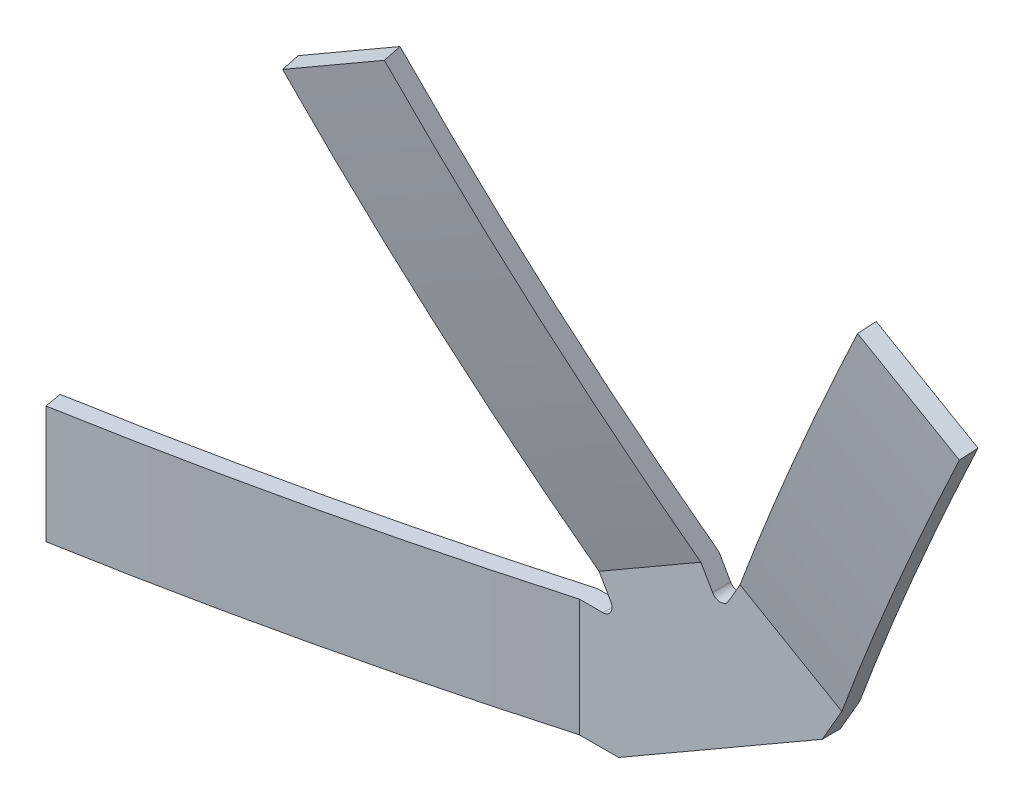
ISO-10303-21;
HEADER;
FILE_DESCRIPTION(('STEP AP214'),'2;1');
FILE_NAME('part.step','',(''),(''),'','','');
FILE_SCHEMA(('AUTOMOTIVE_DESIGN { 1 0 10303 214 1 1 1 1 }'));
ENDSEC;
DATA;
#1=APPLICATION_CONTEXT('core data for automotive mechanical design processes');
#2=APPLICATION_PROTOCOL_DEFINITION('international standard','automotive_design',2000,#1);
#3=PRODUCT_CONTEXT('',#1,'mechanical');
#4=PRODUCT('Part','Part','',(#3));
#5=PRODUCT_RELATED_PRODUCT_CATEGORY('part','',(#4));
#6=PRODUCT_DEFINITION_FORMATION('','',#4);
#7=PRODUCT_DEFINITION_CONTEXT('part definition',#1,'design');
#8=PRODUCT_DEFINITION('design','',#6,#7);
#9=PRODUCT_DEFINITION_SHAPE('','',#8);
#10=(LENGTH_UNIT() NAMED_UNIT(*) SI_UNIT(.MILLI.,.METRE.));
#11=(NAMED_UNIT(*) PLANE_ANGLE_UNIT() SI_UNIT($,.RADIAN.));
#12=(NAMED_UNIT(*) SI_UNIT($,.STERADIAN.) SOLID_ANGLE_UNIT());
#13=UNCERTAINTY_MEASURE_WITH_UNIT(LENGTH_MEASURE(1.E-05),#10,'distance_accuracy_value','');
#14=(GEOMETRIC_REPRESENTATION_CONTEXT(3) GLOBAL_UNCERTAINTY_ASSIGNED_CONTEXT((#13)) GLOBAL_UNIT_ASSIGNED_CONTEXT((#10,
#11,#12)) REPRESENTATION_CONTEXT('',''));
#15=CARTESIAN_POINT('',(0.,0.,0.));
#16=DIRECTION('',(0.,0.,1.));
#17=DIRECTION('',(1.,0.,0.));
#18=AXIS2_PLACEMENT_3D('',#15,#16,#17);
#19=CARTESIAN_POINT('',(26.8467875173177,6.50000000000006,2.));
#20=DIRECTION('',(-0.866025403784435,0.500000000000007,0.));
#21=DIRECTION('',(-0.500000000000007,-0.866025403784435,0.));
#22=AXIS2_PLACEMENT_3D('',#19,#20,#21);
#23=PLANE('',#22);
#24=DIRECTION('',(0.500000000000007,0.866025403784435,0.));
#25=VECTOR('',#24,1.);
#26=CARTESIAN_POINT('',(26.8467875173177,6.50000000000006,0.));
#27=LINE('',#26,#25);
#28=CARTESIAN_POINT('',(26.8467875173177,6.50000000000006,0.));
#29=VERTEX_POINT('',#28);
#30=CARTESIAN_POINT('',(29.0118510267785,10.2499999999999,0.));
#31=VERTEX_POINT('',#30);
#32=EDGE_CURVE('E164',#29,#31,#27,.T.);
#33=ORIENTED_EDGE('',*,*,#32,.T.);
#34=CARTESIAN_POINT('',(95.154945516374,124.813200225808,-465.057436623551));
#35=DIRECTION('',(0.866025403784437,-0.500000000000003,0.));
#36=DIRECTION('',(-0.500000000000003,-0.866025403784437,0.));
#37=AXIS2_PLACEMENT_3D('',#34,#35,#36);
#38=CIRCLE('',#37,483.506003223854);
#39=CARTESIAN_POINT('',(53.1812171455081,52.112570104373,11.1052243024201));
#40=VERTEX_POINT('',#39);
#41=EDGE_CURVE('E297',#40,#31,#38,.T.);
#42=ORIENTED_EDGE('',*,*,#41,.F.);
#43=DIRECTION('',(0.0868111835034082,0.150361380493086,-0.984812303779228));
#44=VECTOR('',#43,1.);
#45=CARTESIAN_POINT('',(53.0141927083141,51.8232752930475,13.));
#46=LINE('',#45,#44);
#47=CARTESIAN_POINT('',(53.0141927083141,51.8232752930475,13.));
#48=VERTEX_POINT('',#47);
#49=EDGE_CURVE('E292',#48,#40,#46,.T.);
#50=ORIENTED_EDGE('',*,*,#49,.F.);
#51=CARTESIAN_POINT('',(95.154945516374,124.813200225808,-465.057436623551));
#52=DIRECTION('',(-0.866025403784437,0.500000000000003,0.));
#53=DIRECTION('',(-0.500000000000003,-0.866025403784437,0.));
#54=AXIS2_PLACEMENT_3D('',#51,#52,#53);
#55=CIRCLE('',#54,485.43);
#56=CARTESIAN_POINT('',(29.0118510267787,10.2499999999999,2.));
#57=VERTEX_POINT('',#56);
#58=EDGE_CURVE('E288',#57,#48,#55,.T.);
#59=ORIENTED_EDGE('',*,*,#58,.F.);
#60=DIRECTION('',(0.500000000000007,0.866025403784435,0.));
#61=VECTOR('',#60,1.);
#62=CARTESIAN_POINT('',(26.8467875173177,6.50000000000006,2.));
#63=LINE('',#62,#61);
#64=CARTESIAN_POINT('',(26.8467875173177,6.50000000000006,2.));
#65=VERTEX_POINT('',#64);
#66=EDGE_CURVE('E92',#65,#57,#63,.T.);
#67=ORIENTED_EDGE('',*,*,#66,.F.);
#68=DIRECTION('',(0.,0.,-1.));
#69=VECTOR('',#68,1.);
#70=CARTESIAN_POINT('',(26.8467875173177,6.50000000000006,2.));
#71=LINE('',#70,#69);
#72=EDGE_CURVE('E183',#65,#29,#71,.T.);
#73=ORIENTED_EDGE('',*,*,#72,.T.);
#74=EDGE_LOOP('',(#33,#42,#50,#59,#67,#73));
#75=FACE_BOUND('',#74,.T.);
#76=ADVANCED_FACE('F34',(#75),#23,.F.);
#77=CARTESIAN_POINT('',(17.7535207775811,16.7500000000001,2.));
#78=DIRECTION('',(0.866025403784434,-0.500000000000008,0.));
#79=DIRECTION('',(0.500000000000008,0.866025403784434,0.));
#80=AXIS2_PLACEMENT_3D('',#77,#78,#79);
#81=PLANE('',#80);
#82=DIRECTION('',(-0.500000000000008,-0.866025403784434,0.));
#83=VECTOR('',#82,1.);
#84=CARTESIAN_POINT('',(17.7535207775811,16.7500000000001,0.));
#85=LINE('',#84,#83);
#86=CARTESIAN_POINT('',(17.7535207775811,16.7500000000001,0.));
#87=VERTEX_POINT('',#86);
#88=CARTESIAN_POINT('',(16.4544826719044,14.5,0.));
#89=VERTEX_POINT('',#88);
#90=EDGE_CURVE('E189',#87,#89,#85,.T.);
#91=ORIENTED_EDGE('',*,*,#90,.T.);
#92=DIRECTION('',(0.,0.,-1.));
#93=VECTOR('',#92,1.);
#94=CARTESIAN_POINT('',(16.4544826719044,14.5,2.));
#95=LINE('',#94,#93);
#96=CARTESIAN_POINT('',(16.4544826719044,14.5,2.));
#97=VERTEX_POINT('',#96);
#98=EDGE_CURVE('E11',#97,#89,#95,.T.);
#99=ORIENTED_EDGE('',*,*,#98,.F.);
#100=DIRECTION('',(-0.500000000000008,-0.866025403784434,0.));
#101=VECTOR('',#100,1.);
#102=CARTESIAN_POINT('',(17.7535207775811,16.7500000000001,2.));
#103=LINE('',#102,#101);
#104=CARTESIAN_POINT('',(17.7535207775811,16.7500000000001,2.));
#105=VERTEX_POINT('',#104);
#106=EDGE_CURVE('E169',#105,#97,#103,.T.);
#107=ORIENTED_EDGE('',*,*,#106,.F.);
#108=CARTESIAN_POINT('',(83.8966152671763,131.313200225808,-465.057436623551));
#109=DIRECTION('',(-0.866025403784437,0.500000000000003,0.));
#110=DIRECTION('',(-0.500000000000003,-0.866025403784437,0.));
#111=AXIS2_PLACEMENT_3D('',#108,#109,#110);
#112=CIRCLE('',#111,485.43);
#113=CARTESIAN_POINT('',(41.7558624591164,58.3232752930475,13.));
#114=VERTEX_POINT('',#113);
#115=EDGE_CURVE('E306',#105,#114,#112,.T.);
#116=ORIENTED_EDGE('',*,*,#115,.T.);
#117=DIRECTION('',(0.0868111835034082,0.150361380493086,-0.984812303779228));
#118=VECTOR('',#117,1.);
#119=CARTESIAN_POINT('',(41.7558624591164,58.3232752930475,13.));
#120=LINE('',#119,#118);
#121=CARTESIAN_POINT('',(41.9228868963104,58.612570104373,11.1052243024201));
#122=VERTEX_POINT('',#121);
#123=EDGE_CURVE('E300',#114,#122,#120,.T.);
#124=ORIENTED_EDGE('',*,*,#123,.T.);
#125=CARTESIAN_POINT('',(83.8966152671763,131.313200225808,-465.057436623551));
#126=DIRECTION('',(0.866025403784437,-0.500000000000003,0.));
#127=DIRECTION('',(-0.500000000000003,-0.866025403784437,0.));
#128=AXIS2_PLACEMENT_3D('',#125,#126,#127);
#129=CIRCLE('',#128,483.506003223854);
#130=EDGE_CURVE('E295',#122,#87,#129,.T.);
#131=ORIENTED_EDGE('',*,*,#130,.T.);
#132=EDGE_LOOP('',(#91,#99,#107,#116,#124,#131));
#133=FACE_BOUND('',#132,.T.);
#134=ADVANCED_FACE('F348',(#133),#81,.F.);
#135=CARTESIAN_POINT('',(15.5884572681199,15.,2.));
#136=DIRECTION('',(0.,0.,-1.));
#137=DIRECTION('',(-1.,0.,0.));
#138=AXIS2_PLACEMENT_3D('',#135,#136,#137);
#139=CYLINDRICAL_SURFACE('',#138,0.999999999999999);
#140=CARTESIAN_POINT('',(15.5884572681199,15.,0.));
#141=DIRECTION('',(0.,0.,-1.));
#142=DIRECTION('',(1.,0.,0.));
#143=AXIS2_PLACEMENT_3D('',#140,#141,#142);
#144=CIRCLE('',#143,0.999999999999999);
#145=CARTESIAN_POINT('',(14.7224318643355,14.5,0.));
#146=VERTEX_POINT('',#145);
#147=EDGE_CURVE('E191',#89,#146,#144,.T.);
#148=ORIENTED_EDGE('',*,*,#147,.T.);
#149=DIRECTION('',(0.,0.,-1.));
#150=VECTOR('',#149,1.);
#151=CARTESIAN_POINT('',(14.7224318643355,14.5,2.));
#152=LINE('',#151,#150);
#153=CARTESIAN_POINT('',(14.7224318643355,14.5,2.));
#154=VERTEX_POINT('',#153);
#155=EDGE_CURVE('E42',#154,#146,#152,.T.);
#156=ORIENTED_EDGE('',*,*,#155,.F.);
#157=CARTESIAN_POINT('',(15.5884572681199,15.,2.));
#158=DIRECTION('',(0.,0.,-1.));
#159=DIRECTION('',(1.,0.,0.));
#160=AXIS2_PLACEMENT_3D('',#157,#158,#159);
#161=CIRCLE('',#160,0.999999999999999);
#162=EDGE_CURVE('E171',#97,#154,#161,.T.);
#163=ORIENTED_EDGE('',*,*,#162,.F.);
#164=ORIENTED_EDGE('',*,*,#98,.T.);
#165=EDGE_LOOP('',(#148,#156,#163,#164));
#166=FACE_BOUND('',#165,.T.);
#167=ADVANCED_FACE('F350',(#166),#139,.F.);
#168=CARTESIAN_POINT('',(14.7224318643355,14.5,2.));
#169=DIRECTION('',(-0.86602540378444,-0.499999999999997,0.));
#170=DIRECTION('',(0.499999999999997,-0.86602540378444,0.));
#171=AXIS2_PLACEMENT_3D('',#168,#169,#170);
#172=PLANE('',#171);
#173=DIRECTION('',(-0.499999999999997,0.86602540378444,0.));
#174=VECTOR('',#173,1.);
#175=CARTESIAN_POINT('',(14.7224318643355,14.5,0.));
#176=LINE('',#175,#174);
#177=CARTESIAN_POINT('',(13.4233937586586,16.75,0.));
#178=VERTEX_POINT('',#177);
#179=EDGE_CURVE('E193',#146,#178,#176,.T.);
#180=ORIENTED_EDGE('',*,*,#179,.T.);
#181=CARTESIAN_POINT('',(-52.7197007309364,131.313200225808,-465.057436623551));
#182=DIRECTION('',(0.866025403784439,0.499999999999999,0.));
#183=DIRECTION('',(0.499999999999999,-0.866025403784439,0.));
#184=AXIS2_PLACEMENT_3D('',#181,#182,#183);
#185=CIRCLE('',#184,483.506003223854);
#186=CARTESIAN_POINT('',(-10.7459723600708,58.6125701043732,11.1052243024201));
#187=VERTEX_POINT('',#186);
#188=EDGE_CURVE('E241',#187,#178,#185,.T.);
#189=ORIENTED_EDGE('',*,*,#188,.F.);
#190=DIRECTION('',(-0.0868111835034071,0.150361380493087,-0.984812303779228));
#191=VECTOR('',#190,1.);
#192=CARTESIAN_POINT('',(-10.5789479228768,58.3232752930476,13.));
#193=LINE('',#192,#191);
#194=CARTESIAN_POINT('',(-10.5789479228768,58.3232752930476,13.));
#195=VERTEX_POINT('',#194);
#196=EDGE_CURVE('E245',#195,#187,#193,.T.);
#197=ORIENTED_EDGE('',*,*,#196,.F.);
#198=CARTESIAN_POINT('',(-52.7197007309364,131.313200225808,-465.057436623551));
#199=DIRECTION('',(-0.866025403784439,-0.499999999999999,0.));
#200=DIRECTION('',(0.499999999999999,-0.866025403784439,0.));
#201=AXIS2_PLACEMENT_3D('',#198,#199,#200);
#202=CIRCLE('',#201,485.43);
#203=CARTESIAN_POINT('',(13.4233937586588,16.75,2.));
#204=VERTEX_POINT('',#203);
#205=EDGE_CURVE('E249',#204,#195,#202,.T.);
#206=ORIENTED_EDGE('',*,*,#205,.F.);
#207=DIRECTION('',(-0.499999999999997,0.86602540378444,0.));
#208=VECTOR('',#207,1.);
#209=CARTESIAN_POINT('',(14.7224318643355,14.5,2.));
#210=LINE('',#209,#208);
#211=EDGE_CURVE('E173',#154,#204,#210,.T.);
#212=ORIENTED_EDGE('',*,*,#211,.F.);
#213=ORIENTED_EDGE('',*,*,#155,.T.);
#214=EDGE_LOOP('',(#180,#189,#197,#206,#212,#213));
#215=FACE_BOUND('',#214,.T.);
#216=ADVANCED_FACE('F224',(#215),#172,.F.);
#217=CARTESIAN_POINT('',(2.16506350946103,10.2500000000002,2.));
#218=DIRECTION('',(0.866025403784441,0.499999999999996,0.));
#219=DIRECTION('',(-0.499999999999996,0.866025403784441,0.));
#220=AXIS2_PLACEMENT_3D('',#217,#218,#219);
#221=PLANE('',#220);
#222=DIRECTION('',(0.499999999999996,-0.866025403784441,0.));
#223=VECTOR('',#222,1.);
#224=CARTESIAN_POINT('',(2.16506350946103,10.2500000000002,0.));
#225=LINE('',#224,#223);
#226=CARTESIAN_POINT('',(2.16506350946103,10.2500000000002,0.));
#227=VERTEX_POINT('',#226);
#228=CARTESIAN_POINT('',(3.46410161513777,8.00000000000001,0.));
#229=VERTEX_POINT('',#228);
#230=EDGE_CURVE('E199',#227,#229,#225,.T.);
#231=ORIENTED_EDGE('',*,*,#230,.T.);
#232=DIRECTION('',(0.,0.,-1.));
#233=VECTOR('',#232,1.);
#234=CARTESIAN_POINT('',(3.46410161513777,8.00000000000001,2.));
#235=LINE('',#234,#233);
#236=CARTESIAN_POINT('',(3.46410161513777,8.00000000000001,2.));
#237=VERTEX_POINT('',#236);
#238=EDGE_CURVE('E217',#237,#229,#235,.T.);
#239=ORIENTED_EDGE('',*,*,#238,.F.);
#240=DIRECTION('',(0.499999999999996,-0.866025403784441,0.));
#241=VECTOR('',#240,1.);
#242=CARTESIAN_POINT('',(2.16506350946103,10.2500000000002,2.));
#243=LINE('',#242,#241);
#244=CARTESIAN_POINT('',(2.16506350946103,10.2500000000002,2.));
#245=VERTEX_POINT('',#244);
#246=EDGE_CURVE('E177',#245,#237,#243,.T.);
#247=ORIENTED_EDGE('',*,*,#246,.F.);
#248=CARTESIAN_POINT('',(-63.9780309801341,124.813200225808,-465.057436623551));
#249=DIRECTION('',(-0.866025403784439,-0.499999999999999,0.));
#250=DIRECTION('',(0.499999999999999,-0.866025403784439,0.));
#251=AXIS2_PLACEMENT_3D('',#248,#249,#250);
#252=CIRCLE('',#251,485.43);
#253=CARTESIAN_POINT('',(-21.8372781720745,51.8232752930476,13.));
#254=VERTEX_POINT('',#253);
#255=EDGE_CURVE('E253',#245,#254,#252,.T.);
#256=ORIENTED_EDGE('',*,*,#255,.T.);
#257=DIRECTION('',(-0.0868111835034071,0.150361380493087,-0.984812303779228));
#258=VECTOR('',#257,1.);
#259=CARTESIAN_POINT('',(-21.8372781720745,51.8232752930476,13.));
#260=LINE('',#259,#258);
#261=CARTESIAN_POINT('',(-22.0043026092685,52.1125701043732,11.1052243024201));
#262=VERTEX_POINT('',#261);
#263=EDGE_CURVE('E256',#254,#262,#260,.T.);
#264=ORIENTED_EDGE('',*,*,#263,.T.);
#265=CARTESIAN_POINT('',(-63.9780309801341,124.813200225808,-465.057436623551));
#266=DIRECTION('',(0.866025403784439,0.499999999999999,0.));
#267=DIRECTION('',(0.499999999999999,-0.866025403784439,0.));
#268=AXIS2_PLACEMENT_3D('',#265,#266,#267);
#269=CIRCLE('',#268,483.506003223854);
#270=EDGE_CURVE('E260',#262,#227,#269,.T.);
#271=ORIENTED_EDGE('',*,*,#270,.T.);
#272=EDGE_LOOP('',(#231,#239,#247,#256,#264,#271));
#273=FACE_BOUND('',#272,.T.);
#274=ADVANCED_FACE('F357',(#273),#221,.F.);
#275=CARTESIAN_POINT('',(2.5980762113533,7.5,2.));
#276=DIRECTION('',(0.,0.,-1.));
#277=DIRECTION('',(-1.,0.,0.));
#278=AXIS2_PLACEMENT_3D('',#275,#276,#277);
#279=CYLINDRICAL_SURFACE('',#278,1.00000000000001);
#280=CARTESIAN_POINT('',(2.5980762113533,7.5,0.));
#281=DIRECTION('',(0.,0.,-1.));
#282=DIRECTION('',(1.,0.,0.));
#283=AXIS2_PLACEMENT_3D('',#280,#281,#282);
#284=CIRCLE('',#283,1.00000000000001);
#285=CARTESIAN_POINT('',(2.5980762113533,6.49999999999998,0.));
#286=VERTEX_POINT('',#285);
#287=EDGE_CURVE('E201',#229,#286,#284,.T.);
#288=ORIENTED_EDGE('',*,*,#287,.T.);
#289=DIRECTION('',(0.,0.,-1.));
#290=VECTOR('',#289,1.);
#291=CARTESIAN_POINT('',(2.5980762113533,6.49999999999998,2.));
#292=LINE('',#291,#290);
#293=CARTESIAN_POINT('',(2.5980762113533,6.49999999999998,2.));
#294=VERTEX_POINT('',#293);
#295=EDGE_CURVE('E214',#294,#286,#292,.T.);
#296=ORIENTED_EDGE('',*,*,#295,.F.);
#297=CARTESIAN_POINT('',(2.5980762113533,7.5,2.));
#298=DIRECTION('',(0.,0.,-1.));
#299=DIRECTION('',(1.,0.,0.));
#300=AXIS2_PLACEMENT_3D('',#297,#298,#299);
#301=CIRCLE('',#300,1.00000000000001);
#302=EDGE_CURVE('E179',#237,#294,#301,.T.);
#303=ORIENTED_EDGE('',*,*,#302,.F.);
#304=ORIENTED_EDGE('',*,*,#238,.T.);
#305=EDGE_LOOP('',(#288,#296,#303,#304));
#306=FACE_BOUND('',#305,.T.);
#307=ADVANCED_FACE('F384',(#306),#279,.F.);
#308=CARTESIAN_POINT('',(2.5980762113533,6.5,2.));
#309=DIRECTION('',(0.,-1.,0.));
#310=DIRECTION('',(0.,0.,-1.));
#311=AXIS2_PLACEMENT_3D('',#308,#309,#310);
#312=PLANE('',#311);
#313=DIRECTION('',(-1.,0.,0.));
#314=VECTOR('',#313,1.);
#315=CARTESIAN_POINT('',(2.5980762113533,6.5,0.));
#316=LINE('',#315,#314);
#317=CARTESIAN_POINT('',(-1.89960891026766E-13,6.5,0.));
#318=VERTEX_POINT('',#317);
#319=EDGE_CURVE('E203',#286,#318,#316,.T.);
#320=ORIENTED_EDGE('',*,*,#319,.T.);
#321=CARTESIAN_POINT('',(-132.286188979191,6.49999999999976,-465.057436623551));
#322=DIRECTION('',(0.,1.,0.));
#323=DIRECTION('',(1.,0.,0.));
#324=AXIS2_PLACEMENT_3D('',#321,#322,#323);
#325=CIRCLE('',#324,483.506003223854);
#326=CARTESIAN_POINT('',(-48.3387322374591,6.49999999999991,11.1052243024201));
#327=VERTEX_POINT('',#326);
#328=EDGE_CURVE('E155',#327,#318,#325,.T.);
#329=ORIENTED_EDGE('',*,*,#328,.F.);
#330=DIRECTION('',(-0.173622367006815,0.,-0.984812303779228));
#331=VECTOR('',#330,1.);
#332=CARTESIAN_POINT('',(-48.0046833630711,6.49999999999991,13.));
#333=LINE('',#332,#331);
#334=CARTESIAN_POINT('',(-48.0046833630711,6.49999999999991,13.));
#335=VERTEX_POINT('',#334);
#336=EDGE_CURVE('E262',#335,#327,#333,.T.);
#337=ORIENTED_EDGE('',*,*,#336,.F.);
#338=CARTESIAN_POINT('',(-132.286188979191,6.49999999999976,-465.057436623551));
#339=DIRECTION('',(0.,-1.,0.));
#340=DIRECTION('',(1.,0.,0.));
#341=AXIS2_PLACEMENT_3D('',#338,#339,#340);
#342=CIRCLE('',#341,485.43);
#343=CARTESIAN_POINT('',(0.,6.5,2.));
#344=VERTEX_POINT('',#343);
#345=EDGE_CURVE('E160',#344,#335,#342,.T.);
#346=ORIENTED_EDGE('',*,*,#345,.F.);
#347=DIRECTION('',(-1.,0.,0.));
#348=VECTOR('',#347,1.);
#349=CARTESIAN_POINT('',(2.5980762113533,6.5,2.));
#350=LINE('',#349,#348);
#351=EDGE_CURVE('E127',#294,#344,#350,.T.);
#352=ORIENTED_EDGE('',*,*,#351,.F.);
#353=ORIENTED_EDGE('',*,*,#295,.T.);
#354=EDGE_LOOP('',(#320,#329,#337,#346,#352,#353));
#355=FACE_BOUND('',#354,.T.);
#356=ADVANCED_FACE('F276',(#355),#312,.F.);
#357=CARTESIAN_POINT('',(-1.66533453693773E-13,-6.5,2.));
#358=DIRECTION('',(0.,1.,0.));
#359=DIRECTION('',(-1.,0.,0.));
#360=AXIS2_PLACEMENT_3D('',#357,#358,#359);
#361=PLANE('',#360);
#362=DIRECTION('',(1.,0.,0.));
#363=VECTOR('',#362,1.);
#364=CARTESIAN_POINT('',(-1.66533453693773E-13,-6.5,0.));
#365=LINE('',#364,#363);
#366=CARTESIAN_POINT('',(-1.66533453693773E-13,-6.5,0.));
#367=VERTEX_POINT('',#366);
#368=CARTESIAN_POINT('',(4.33012701892221,-6.49999999999999,0.));
#369=VERTEX_POINT('',#368);
#370=EDGE_CURVE('E209',#367,#369,#365,.T.);
#371=ORIENTED_EDGE('',*,*,#370,.T.);
#372=DIRECTION('',(0.,0.,-1.));
#373=VECTOR('',#372,1.);
#374=CARTESIAN_POINT('',(4.33012701892221,-6.49999999999999,2.));
#375=LINE('',#374,#373);
#376=CARTESIAN_POINT('',(4.33012701892221,-6.49999999999999,2.));
#377=VERTEX_POINT('',#376);
#378=EDGE_CURVE('E139',#377,#369,#375,.T.);
#379=ORIENTED_EDGE('',*,*,#378,.F.);
#380=DIRECTION('',(1.,0.,0.));
#381=VECTOR('',#380,1.);
#382=CARTESIAN_POINT('',(-1.66533453693773E-13,-6.5,2.));
#383=LINE('',#382,#381);
#384=CARTESIAN_POINT('',(-1.66533453693773E-13,-6.5,2.));
#385=VERTEX_POINT('',#384);
#386=EDGE_CURVE('E124',#385,#377,#383,.T.);
#387=ORIENTED_EDGE('',*,*,#386,.F.);
#388=CARTESIAN_POINT('',(-132.28618897919,-6.50000000000024,-465.057436623551));
#389=DIRECTION('',(0.,-1.,0.));
#390=DIRECTION('',(1.,0.,0.));
#391=AXIS2_PLACEMENT_3D('',#388,#389,#390);
#392=CIRCLE('',#391,485.43);
#393=CARTESIAN_POINT('',(-48.0046833630711,-6.50000000000009,13.));
#394=VERTEX_POINT('',#393);
#395=EDGE_CURVE('E138',#385,#394,#392,.T.);
#396=ORIENTED_EDGE('',*,*,#395,.T.);
#397=DIRECTION('',(-0.173622367006815,0.,-0.984812303779228));
#398=VECTOR('',#397,1.);
#399=CARTESIAN_POINT('',(-48.0046833630711,-6.50000000000009,13.));
#400=LINE('',#399,#398);
#401=CARTESIAN_POINT('',(-48.338732237459,-6.50000000000009,11.1052243024201));
#402=VERTEX_POINT('',#401);
#403=EDGE_CURVE('E146',#394,#402,#400,.T.);
#404=ORIENTED_EDGE('',*,*,#403,.T.);
#405=CARTESIAN_POINT('',(-132.28618897919,-6.50000000000024,-465.057436623551));
#406=DIRECTION('',(0.,1.,0.));
#407=DIRECTION('',(1.,0.,0.));
#408=AXIS2_PLACEMENT_3D('',#405,#406,#407);
#409=CIRCLE('',#408,483.506003223854);
#410=EDGE_CURVE('E149',#402,#367,#409,.T.);
#411=ORIENTED_EDGE('',*,*,#410,.T.);
#412=EDGE_LOOP('',(#371,#379,#387,#396,#404,#411));
#413=FACE_BOUND('',#412,.T.);
#414=ADVANCED_FACE('F135',(#413),#361,.F.);
#415=CARTESIAN_POINT('',(24.2487113059643,5.00000000000001,2.));
#416=DIRECTION('',(-0.500000000000001,0.866025403784438,0.));
#417=DIRECTION('',(-0.866025403784438,-0.500000000000001,0.));
#418=AXIS2_PLACEMENT_3D('',#415,#416,#417);
#419=PLANE('',#418);
#420=DIRECTION('',(0.866025403784438,0.500000000000001,0.));
#421=VECTOR('',#420,1.);
#422=CARTESIAN_POINT('',(24.2487113059643,5.00000000000001,0.));
#423=LINE('',#422,#421);
#424=EDGE_CURVE('E82',#369,#29,#423,.T.);
#425=ORIENTED_EDGE('',*,*,#424,.T.);
#426=ORIENTED_EDGE('',*,*,#72,.F.);
#427=DIRECTION('',(0.866025403784438,0.5,0.));
#428=VECTOR('',#427,1.);
#429=CARTESIAN_POINT('',(4.33012701892221,-6.49999999999999,2.));
#430=LINE('',#429,#428);
#431=EDGE_CURVE('E50',#377,#65,#430,.T.);
#432=ORIENTED_EDGE('',*,*,#431,.F.);
#433=ORIENTED_EDGE('',*,*,#378,.T.);
#434=EDGE_LOOP('',(#425,#426,#432,#433));
#435=FACE_BOUND('',#434,.T.);
#436=ADVANCED_FACE('F283',(#435),#419,.F.);
#437=CARTESIAN_POINT('',(15.5884572681199,15.,2.));
#438=DIRECTION('',(0.,0.,1.));
#439=DIRECTION('',(1.,0.,0.));
#440=AXIS2_PLACEMENT_3D('',#437,#438,#439);
#441=PLANE('',#440);
#442=ORIENTED_EDGE('',*,*,#66,.T.);
#443=DIRECTION('',(-0.866025403784353,0.500000000000148,0.));
#444=VECTOR('',#443,1.);
#445=CARTESIAN_POINT('',(29.0118510267787,10.2499999999999,2.));
#446=LINE('',#445,#444);
#447=EDGE_CURVE('E167',#57,#105,#446,.T.);
#448=ORIENTED_EDGE('',*,*,#447,.T.);
#449=ORIENTED_EDGE('',*,*,#106,.T.);
#450=ORIENTED_EDGE('',*,*,#162,.T.);
#451=ORIENTED_EDGE('',*,*,#211,.T.);
#452=DIRECTION('',(-0.866025403784524,-0.499999999999852,0.));
#453=VECTOR('',#452,1.);
#454=CARTESIAN_POINT('',(13.4233937586588,16.75,2.));
#455=LINE('',#454,#453);
#456=EDGE_CURVE('E175',#204,#245,#455,.T.);
#457=ORIENTED_EDGE('',*,*,#456,.T.);
#458=ORIENTED_EDGE('',*,*,#246,.T.);
#459=ORIENTED_EDGE('',*,*,#302,.T.);
#460=ORIENTED_EDGE('',*,*,#351,.T.);
#461=DIRECTION('',(-1.6826817716975E-13,-1.,0.));
#462=VECTOR('',#461,1.);
#463=CARTESIAN_POINT('',(0.,6.5,2.));
#464=LINE('',#463,#462);
#465=EDGE_CURVE('E121',#344,#385,#464,.T.);
#466=ORIENTED_EDGE('',*,*,#465,.T.);
#467=ORIENTED_EDGE('',*,*,#386,.T.);
#468=ORIENTED_EDGE('',*,*,#431,.T.);
#469=EDGE_LOOP('',(#442,#448,#449,#450,#451,#457,#458,#459,#460,#466,#467,#468));
#470=FACE_BOUND('',#469,.T.);
#471=ADVANCED_FACE('F123',(#470),#441,.T.);
#472=CARTESIAN_POINT('',(15.5884572681199,15.,0.));
#473=DIRECTION('',(0.,0.,1.));
#474=DIRECTION('',(1.,0.,0.));
#475=AXIS2_PLACEMENT_3D('',#472,#473,#474);
#476=PLANE('',#475);
#477=ORIENTED_EDGE('',*,*,#32,.F.);
#478=ORIENTED_EDGE('',*,*,#424,.F.);
#479=ORIENTED_EDGE('',*,*,#370,.F.);
#480=DIRECTION('',(-1.6826817716975E-13,-1.,0.));
#481=VECTOR('',#480,1.);
#482=CARTESIAN_POINT('',(0.,-5.5,0.));
#483=LINE('',#482,#481);
#484=EDGE_CURVE('E206',#318,#367,#483,.T.);
#485=ORIENTED_EDGE('',*,*,#484,.F.);
#486=ORIENTED_EDGE('',*,*,#319,.F.);
#487=ORIENTED_EDGE('',*,*,#287,.F.);
#488=ORIENTED_EDGE('',*,*,#230,.F.);
#489=DIRECTION('',(-0.866025403784525,-0.499999999999851,0.));
#490=VECTOR('',#489,1.);
#491=CARTESIAN_POINT('',(3.03108891324556,10.75,0.));
#492=LINE('',#491,#490);
#493=EDGE_CURVE('E196',#178,#227,#492,.T.);
#494=ORIENTED_EDGE('',*,*,#493,.F.);
#495=ORIENTED_EDGE('',*,*,#179,.F.);
#496=ORIENTED_EDGE('',*,*,#147,.F.);
#497=ORIENTED_EDGE('',*,*,#90,.F.);
#498=DIRECTION('',(-0.866025403784352,0.50000000000015,0.));
#499=VECTOR('',#498,1.);
#500=CARTESIAN_POINT('',(18.6195461813656,16.2499999999999,0.));
#501=LINE('',#500,#499);
#502=EDGE_CURVE('E186',#31,#87,#501,.T.);
#503=ORIENTED_EDGE('',*,*,#502,.F.);
#504=EDGE_LOOP('',(#477,#478,#479,#485,#486,#487,#488,#494,#495,#496,#497,#503));
#505=FACE_BOUND('',#504,.T.);
#506=ADVANCED_FACE('F232',(#505),#476,.F.);
#507=CARTESIAN_POINT('',(-132.286188979191,6.49999999999976,-465.057436623551));
#508=DIRECTION('',(0.,-1.,0.));
#509=DIRECTION('',(1.,0.,0.));
#510=AXIS2_PLACEMENT_3D('',#507,#508,#509);
#511=CYLINDRICAL_SURFACE('',#510,485.43);
#512=ORIENTED_EDGE('',*,*,#395,.F.);
#513=ORIENTED_EDGE('',*,*,#465,.F.);
#514=ORIENTED_EDGE('',*,*,#345,.T.);
#515=DIRECTION('',(0.,-1.,0.));
#516=VECTOR('',#515,1.);
#517=CARTESIAN_POINT('',(-48.0046833630711,6.49999999999991,13.));
#518=LINE('',#517,#516);
#519=EDGE_CURVE('E144',#335,#394,#518,.T.);
#520=ORIENTED_EDGE('',*,*,#519,.T.);
#521=EDGE_LOOP('',(#512,#513,#514,#520));
#522=FACE_BOUND('',#521,.T.);
#523=ADVANCED_FACE('F142',(#522),#511,.T.);
#524=CARTESIAN_POINT('',(-132.286188979191,6.49999999999976,-465.057436623551));
#525=DIRECTION('',(0.,-1.,0.));
#526=DIRECTION('',(1.,0.,0.));
#527=AXIS2_PLACEMENT_3D('',#524,#525,#526);
#528=CYLINDRICAL_SURFACE('',#527,483.506003223854);
#529=ORIENTED_EDGE('',*,*,#410,.F.);
#530=DIRECTION('',(0.,-1.,0.));
#531=VECTOR('',#530,1.);
#532=CARTESIAN_POINT('',(-48.3387322374591,6.49999999999991,11.1052243024201));
#533=LINE('',#532,#531);
#534=EDGE_CURVE('E161',#327,#402,#533,.T.);
#535=ORIENTED_EDGE('',*,*,#534,.F.);
#536=ORIENTED_EDGE('',*,*,#328,.T.);
#537=ORIENTED_EDGE('',*,*,#484,.T.);
#538=EDGE_LOOP('',(#529,#535,#536,#537));
#539=FACE_BOUND('',#538,.T.);
#540=ADVANCED_FACE('F272',(#539),#528,.F.);
#541=CARTESIAN_POINT('',(-48.0046833630711,6.49999999999991,13.));
#542=DIRECTION('',(-0.984812303779228,0.,0.173622367006815));
#543=DIRECTION('',(0.173622367006815,0.,0.984812303779228));
#544=AXIS2_PLACEMENT_3D('',#541,#542,#543);
#545=PLANE('',#544);
#546=ORIENTED_EDGE('',*,*,#403,.F.);
#547=ORIENTED_EDGE('',*,*,#519,.F.);
#548=ORIENTED_EDGE('',*,*,#336,.T.);
#549=ORIENTED_EDGE('',*,*,#534,.T.);
#550=EDGE_LOOP('',(#546,#547,#548,#549));
#551=FACE_BOUND('',#550,.T.);
#552=ADVANCED_FACE('F282',(#551),#545,.T.);
#553=CARTESIAN_POINT('',(-52.7197007309364,131.313200225808,-465.057436623551));
#554=DIRECTION('',(-0.866025403784439,-0.499999999999999,0.));
#555=DIRECTION('',(0.499999999999999,-0.866025403784439,0.));
#556=AXIS2_PLACEMENT_3D('',#553,#554,#555);
#557=CYLINDRICAL_SURFACE('',#556,485.43);
#558=ORIENTED_EDGE('',*,*,#255,.F.);
#559=ORIENTED_EDGE('',*,*,#456,.F.);
#560=ORIENTED_EDGE('',*,*,#205,.T.);
#561=DIRECTION('',(-0.866025403784439,-0.499999999999999,0.));
#562=VECTOR('',#561,1.);
#563=CARTESIAN_POINT('',(-10.5789479228768,58.3232752930476,13.));
#564=LINE('',#563,#562);
#565=EDGE_CURVE('E152',#195,#254,#564,.T.);
#566=ORIENTED_EDGE('',*,*,#565,.T.);
#567=EDGE_LOOP('',(#558,#559,#560,#566));
#568=FACE_BOUND('',#567,.T.);
#569=ADVANCED_FACE('F318',(#568),#557,.T.);
#570=CARTESIAN_POINT('',(-52.7197007309364,131.313200225808,-465.057436623551));
#571=DIRECTION('',(-0.866025403784439,-0.499999999999999,0.));
#572=DIRECTION('',(0.499999999999999,-0.866025403784439,0.));
#573=AXIS2_PLACEMENT_3D('',#570,#571,#572);
#574=CYLINDRICAL_SURFACE('',#573,483.506003223854);
#575=ORIENTED_EDGE('',*,*,#270,.F.);
#576=DIRECTION('',(-0.866025403784439,-0.499999999999999,0.));
#577=VECTOR('',#576,1.);
#578=CARTESIAN_POINT('',(-10.7459723600708,58.6125701043732,11.1052243024201));
#579=LINE('',#578,#577);
#580=EDGE_CURVE('E147',#187,#262,#579,.T.);
#581=ORIENTED_EDGE('',*,*,#580,.F.);
#582=ORIENTED_EDGE('',*,*,#188,.T.);
#583=ORIENTED_EDGE('',*,*,#493,.T.);
#584=EDGE_LOOP('',(#575,#581,#582,#583));
#585=FACE_BOUND('',#584,.T.);
#586=ADVANCED_FACE('F242',(#585),#574,.F.);
#587=CARTESIAN_POINT('',(-10.5789479228768,58.3232752930476,13.));
#588=DIRECTION('',(-0.492406151889613,0.85287247303229,0.173622367006815));
#589=DIRECTION('',(-0.866025403784439,-0.499999999999999,0.));
#590=AXIS2_PLACEMENT_3D('',#587,#588,#589);
#591=PLANE('',#590);
#592=ORIENTED_EDGE('',*,*,#263,.F.);
#593=ORIENTED_EDGE('',*,*,#565,.F.);
#594=ORIENTED_EDGE('',*,*,#196,.T.);
#595=ORIENTED_EDGE('',*,*,#580,.T.);
#596=EDGE_LOOP('',(#592,#593,#594,#595));
#597=FACE_BOUND('',#596,.T.);
#598=ADVANCED_FACE('F325',(#597),#591,.T.);
#599=CARTESIAN_POINT('',(95.154945516374,124.813200225808,-465.057436623551));
#600=DIRECTION('',(-0.866025403784437,0.500000000000003,0.));
#601=DIRECTION('',(-0.500000000000003,-0.866025403784437,0.));
#602=AXIS2_PLACEMENT_3D('',#599,#600,#601);
#603=CYLINDRICAL_SURFACE('',#602,485.43);
#604=ORIENTED_EDGE('',*,*,#115,.F.);
#605=ORIENTED_EDGE('',*,*,#447,.F.);
#606=ORIENTED_EDGE('',*,*,#58,.T.);
#607=DIRECTION('',(-0.866025403784437,0.500000000000003,0.));
#608=VECTOR('',#607,1.);
#609=CARTESIAN_POINT('',(53.0141927083141,51.8232752930475,13.));
#610=LINE('',#609,#608);
#611=EDGE_CURVE('E305',#48,#114,#610,.T.);
#612=ORIENTED_EDGE('',*,*,#611,.T.);
#613=EDGE_LOOP('',(#604,#605,#606,#612));
#614=FACE_BOUND('',#613,.T.);
#615=ADVANCED_FACE('F345',(#614),#603,.T.);
#616=CARTESIAN_POINT('',(95.154945516374,124.813200225808,-465.057436623551));
#617=DIRECTION('',(-0.866025403784437,0.500000000000003,0.));
#618=DIRECTION('',(-0.500000000000003,-0.866025403784437,0.));
#619=AXIS2_PLACEMENT_3D('',#616,#617,#618);
#620=CYLINDRICAL_SURFACE('',#619,483.506003223854);
#621=ORIENTED_EDGE('',*,*,#130,.F.);
#622=DIRECTION('',(-0.866025403784437,0.500000000000003,0.));
#623=VECTOR('',#622,1.);
#624=CARTESIAN_POINT('',(53.1812171455081,52.112570104373,11.1052243024201));
#625=LINE('',#624,#623);
#626=EDGE_CURVE('E257',#40,#122,#625,.T.);
#627=ORIENTED_EDGE('',*,*,#626,.F.);
#628=ORIENTED_EDGE('',*,*,#41,.T.);
#629=ORIENTED_EDGE('',*,*,#502,.T.);
#630=EDGE_LOOP('',(#621,#627,#628,#629));
#631=FACE_BOUND('',#630,.T.);
#632=ADVANCED_FACE('F441',(#631),#620,.F.);
#633=CARTESIAN_POINT('',(53.0141927083141,51.8232752930475,13.));
#634=DIRECTION('',(0.492406151889617,0.852872473032288,0.173622367006815));
#635=DIRECTION('',(-0.866025403784437,0.500000000000003,0.));
#636=AXIS2_PLACEMENT_3D('',#633,#634,#635);
#637=PLANE('',#636);
#638=ORIENTED_EDGE('',*,*,#123,.F.);
#639=ORIENTED_EDGE('',*,*,#611,.F.);
#640=ORIENTED_EDGE('',*,*,#49,.T.);
#641=ORIENTED_EDGE('',*,*,#626,.T.);
#642=EDGE_LOOP('',(#638,#639,#640,#641));
#643=FACE_BOUND('',#642,.T.);
#644=ADVANCED_FACE('F343',(#643),#637,.T.);
#645=CLOSED_SHELL('',(#76,#134,#167,#216,#274,#307,#356,#414,#436,#471,#506,#523,#540,#552,#569,
#586,#598,#615,#632,#644));
#646=MANIFOLD_SOLID_BREP('B2',#645);
#647=ADVANCED_BREP_SHAPE_REPRESENTATION('',(#18,#646),#14);
#648=SHAPE_DEFINITION_REPRESENTATION(#9,#647);
ENDSEC;
END-ISO-10303-21;
